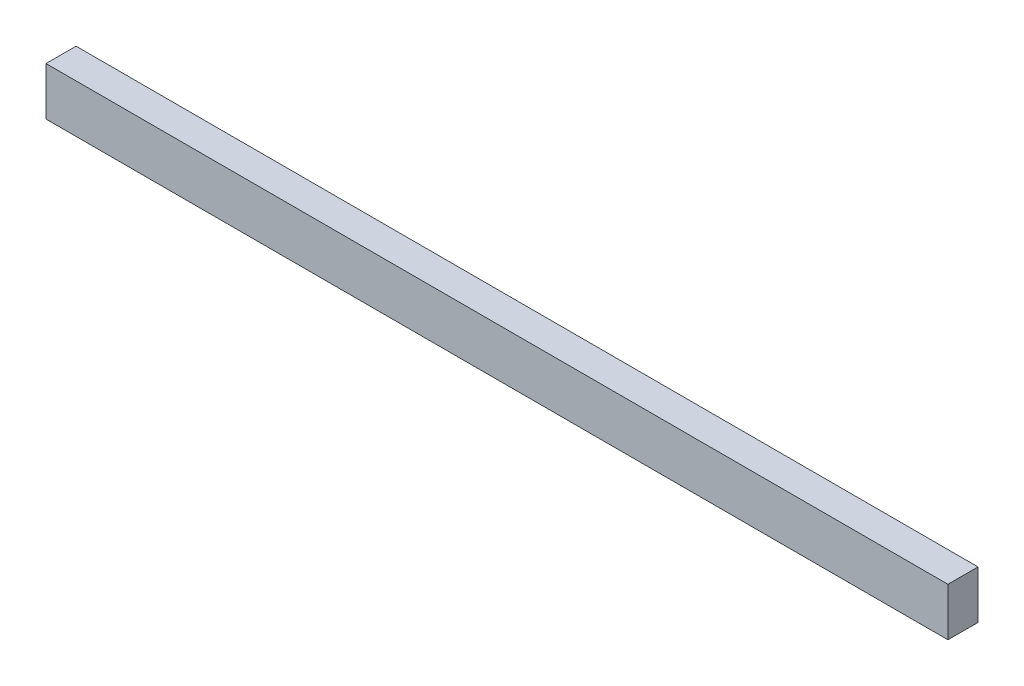
ISO-10303-21;
HEADER;
FILE_DESCRIPTION(('STEP AP214'),'2;1');
FILE_NAME('part.step','',(''),(''),'','','');
FILE_SCHEMA(('AUTOMOTIVE_DESIGN { 1 0 10303 214 1 1 1 1 }'));
ENDSEC;
DATA;
#1=APPLICATION_CONTEXT('core data for automotive mechanical design processes');
#2=APPLICATION_PROTOCOL_DEFINITION('international standard','automotive_design',2000,#1);
#3=PRODUCT_CONTEXT('',#1,'mechanical');
#4=PRODUCT('Part','Part','',(#3));
#5=PRODUCT_RELATED_PRODUCT_CATEGORY('part','',(#4));
#6=PRODUCT_DEFINITION_FORMATION('','',#4);
#7=PRODUCT_DEFINITION_CONTEXT('part definition',#1,'design');
#8=PRODUCT_DEFINITION('design','',#6,#7);
#9=PRODUCT_DEFINITION_SHAPE('','',#8);
#10=(LENGTH_UNIT() NAMED_UNIT(*) SI_UNIT(.MILLI.,.METRE.));
#11=(NAMED_UNIT(*) PLANE_ANGLE_UNIT() SI_UNIT($,.RADIAN.));
#12=(NAMED_UNIT(*) SI_UNIT($,.STERADIAN.) SOLID_ANGLE_UNIT());
#13=UNCERTAINTY_MEASURE_WITH_UNIT(LENGTH_MEASURE(1.E-05),#10,'distance_accuracy_value','');
#14=(GEOMETRIC_REPRESENTATION_CONTEXT(3) GLOBAL_UNCERTAINTY_ASSIGNED_CONTEXT((#13)) GLOBAL_UNIT_ASSIGNED_CONTEXT((#10,
#11,#12)) REPRESENTATION_CONTEXT('',''));
#15=CARTESIAN_POINT('',(0.,0.,0.));
#16=DIRECTION('',(0.,0.,1.));
#17=DIRECTION('',(1.,0.,0.));
#18=AXIS2_PLACEMENT_3D('',#15,#16,#17);
#19=CARTESIAN_POINT('',(0.,0.,25.));
#20=DIRECTION('',(1.,0.,0.));
#21=DIRECTION('',(0.,0.,-1.));
#22=AXIS2_PLACEMENT_3D('',#19,#20,#21);
#23=PLANE('',#22);
#24=DIRECTION('',(0.,-1.,0.));
#25=VECTOR('',#24,1.);
#26=CARTESIAN_POINT('',(0.,0.,0.));
#27=LINE('',#26,#25);
#28=CARTESIAN_POINT('',(0.,40.,0.));
#29=VERTEX_POINT('',#28);
#30=CARTESIAN_POINT('',(0.,0.,0.));
#31=VERTEX_POINT('',#30);
#32=EDGE_CURVE('E96',#29,#31,#27,.T.);
#33=ORIENTED_EDGE('',*,*,#32,.T.);
#34=DIRECTION('',(0.,0.,-1.));
#35=VECTOR('',#34,1.);
#36=CARTESIAN_POINT('',(0.,0.,25.));
#37=LINE('',#36,#35);
#38=CARTESIAN_POINT('',(0.,0.,25.));
#39=VERTEX_POINT('',#38);
#40=EDGE_CURVE('E11',#39,#31,#37,.T.);
#41=ORIENTED_EDGE('',*,*,#40,.F.);
#42=DIRECTION('',(0.,-1.,0.));
#43=VECTOR('',#42,1.);
#44=CARTESIAN_POINT('',(0.,0.,25.));
#45=LINE('',#44,#43);
#46=CARTESIAN_POINT('',(0.,40.,25.));
#47=VERTEX_POINT('',#46);
#48=EDGE_CURVE('E84',#47,#39,#45,.T.);
#49=ORIENTED_EDGE('',*,*,#48,.F.);
#50=DIRECTION('',(0.,0.,-1.));
#51=VECTOR('',#50,1.);
#52=CARTESIAN_POINT('',(0.,40.,25.));
#53=LINE('',#52,#51);
#54=EDGE_CURVE('E92',#47,#29,#53,.T.);
#55=ORIENTED_EDGE('',*,*,#54,.T.);
#56=EDGE_LOOP('',(#33,#41,#49,#55));
#57=FACE_BOUND('',#56,.T.);
#58=ADVANCED_FACE('F33',(#57),#23,.F.);
#59=CARTESIAN_POINT('',(0.,0.,25.));
#60=DIRECTION('',(0.,1.,0.));
#61=DIRECTION('',(0.,0.,1.));
#62=AXIS2_PLACEMENT_3D('',#59,#60,#61);
#63=PLANE('',#62);
#64=DIRECTION('',(1.,0.,0.));
#65=VECTOR('',#64,1.);
#66=CARTESIAN_POINT('',(0.,0.,0.));
#67=LINE('',#66,#65);
#68=CARTESIAN_POINT('',(750.,0.,0.));
#69=VERTEX_POINT('',#68);
#70=EDGE_CURVE('E88',#31,#69,#67,.T.);
#71=ORIENTED_EDGE('',*,*,#70,.T.);
#72=DIRECTION('',(0.,0.,-1.));
#73=VECTOR('',#72,1.);
#74=CARTESIAN_POINT('',(750.,0.,25.));
#75=LINE('',#74,#73);
#76=CARTESIAN_POINT('',(750.,0.,25.));
#77=VERTEX_POINT('',#76);
#78=EDGE_CURVE('E41',#77,#69,#75,.T.);
#79=ORIENTED_EDGE('',*,*,#78,.F.);
#80=DIRECTION('',(1.,0.,0.));
#81=VECTOR('',#80,1.);
#82=CARTESIAN_POINT('',(0.,0.,25.));
#83=LINE('',#82,#81);
#84=EDGE_CURVE('E79',#39,#77,#83,.T.);
#85=ORIENTED_EDGE('',*,*,#84,.F.);
#86=ORIENTED_EDGE('',*,*,#40,.T.);
#87=EDGE_LOOP('',(#71,#79,#85,#86));
#88=FACE_BOUND('',#87,.T.);
#89=ADVANCED_FACE('F87',(#88),#63,.F.);
#90=CARTESIAN_POINT('',(750.,0.,25.));
#91=DIRECTION('',(-1.,0.,0.));
#92=DIRECTION('',(0.,0.,1.));
#93=AXIS2_PLACEMENT_3D('',#90,#91,#92);
#94=PLANE('',#93);
#95=DIRECTION('',(0.,1.,0.));
#96=VECTOR('',#95,1.);
#97=CARTESIAN_POINT('',(750.,0.,0.));
#98=LINE('',#97,#96);
#99=CARTESIAN_POINT('',(750.,40.,0.));
#100=VERTEX_POINT('',#99);
#101=EDGE_CURVE('E66',#69,#100,#98,.T.);
#102=ORIENTED_EDGE('',*,*,#101,.T.);
#103=DIRECTION('',(0.,0.,-1.));
#104=VECTOR('',#103,1.);
#105=CARTESIAN_POINT('',(750.,40.,25.));
#106=LINE('',#105,#104);
#107=CARTESIAN_POINT('',(750.,40.,25.));
#108=VERTEX_POINT('',#107);
#109=EDGE_CURVE('E89',#108,#100,#106,.T.);
#110=ORIENTED_EDGE('',*,*,#109,.F.);
#111=DIRECTION('',(0.,1.,0.));
#112=VECTOR('',#111,1.);
#113=CARTESIAN_POINT('',(750.,0.,25.));
#114=LINE('',#113,#112);
#115=EDGE_CURVE('E82',#77,#108,#114,.T.);
#116=ORIENTED_EDGE('',*,*,#115,.F.);
#117=ORIENTED_EDGE('',*,*,#78,.T.);
#118=EDGE_LOOP('',(#102,#110,#116,#117));
#119=FACE_BOUND('',#118,.T.);
#120=ADVANCED_FACE('F90',(#119),#94,.F.);
#121=CARTESIAN_POINT('',(0.,40.,25.));
#122=DIRECTION('',(0.,-1.,0.));
#123=DIRECTION('',(0.,0.,-1.));
#124=AXIS2_PLACEMENT_3D('',#121,#122,#123);
#125=PLANE('',#124);
#126=DIRECTION('',(-1.,0.,0.));
#127=VECTOR('',#126,1.);
#128=CARTESIAN_POINT('',(0.,40.,0.));
#129=LINE('',#128,#127);
#130=EDGE_CURVE('E72',#100,#29,#129,.T.);
#131=ORIENTED_EDGE('',*,*,#130,.T.);
#132=ORIENTED_EDGE('',*,*,#54,.F.);
#133=DIRECTION('',(-1.,0.,0.));
#134=VECTOR('',#133,1.);
#135=CARTESIAN_POINT('',(0.,40.,25.));
#136=LINE('',#135,#134);
#137=EDGE_CURVE('E49',#108,#47,#136,.T.);
#138=ORIENTED_EDGE('',*,*,#137,.F.);
#139=ORIENTED_EDGE('',*,*,#109,.T.);
#140=EDGE_LOOP('',(#131,#132,#138,#139));
#141=FACE_BOUND('',#140,.T.);
#142=ADVANCED_FACE('F103',(#141),#125,.F.);
#143=CARTESIAN_POINT('',(0.,0.,25.));
#144=DIRECTION('',(0.,0.,-1.));
#145=DIRECTION('',(-1.,0.,0.));
#146=AXIS2_PLACEMENT_3D('',#143,#144,#145);
#147=PLANE('',#146);
#148=ORIENTED_EDGE('',*,*,#48,.T.);
#149=ORIENTED_EDGE('',*,*,#84,.T.);
#150=ORIENTED_EDGE('',*,*,#115,.T.);
#151=ORIENTED_EDGE('',*,*,#137,.T.);
#152=EDGE_LOOP('',(#148,#149,#150,#151));
#153=FACE_BOUND('',#152,.T.);
#154=ADVANCED_FACE('F80',(#153),#147,.F.);
#155=CARTESIAN_POINT('',(0.,0.,0.));
#156=DIRECTION('',(0.,0.,-1.));
#157=DIRECTION('',(-1.,0.,0.));
#158=AXIS2_PLACEMENT_3D('',#155,#156,#157);
#159=PLANE('',#158);
#160=ORIENTED_EDGE('',*,*,#32,.F.);
#161=ORIENTED_EDGE('',*,*,#130,.F.);
#162=ORIENTED_EDGE('',*,*,#101,.F.);
#163=ORIENTED_EDGE('',*,*,#70,.F.);
#164=EDGE_LOOP('',(#160,#161,#162,#163));
#165=FACE_BOUND('',#164,.T.);
#166=ADVANCED_FACE('F106',(#165),#159,.T.);
#167=CLOSED_SHELL('',(#58,#89,#120,#142,#154,#166));
#168=MANIFOLD_SOLID_BREP('B2',#167);
#169=ADVANCED_BREP_SHAPE_REPRESENTATION('',(#18,#168),#14);
#170=SHAPE_DEFINITION_REPRESENTATION(#9,#169);
ENDSEC;
END-ISO-10303-21;
